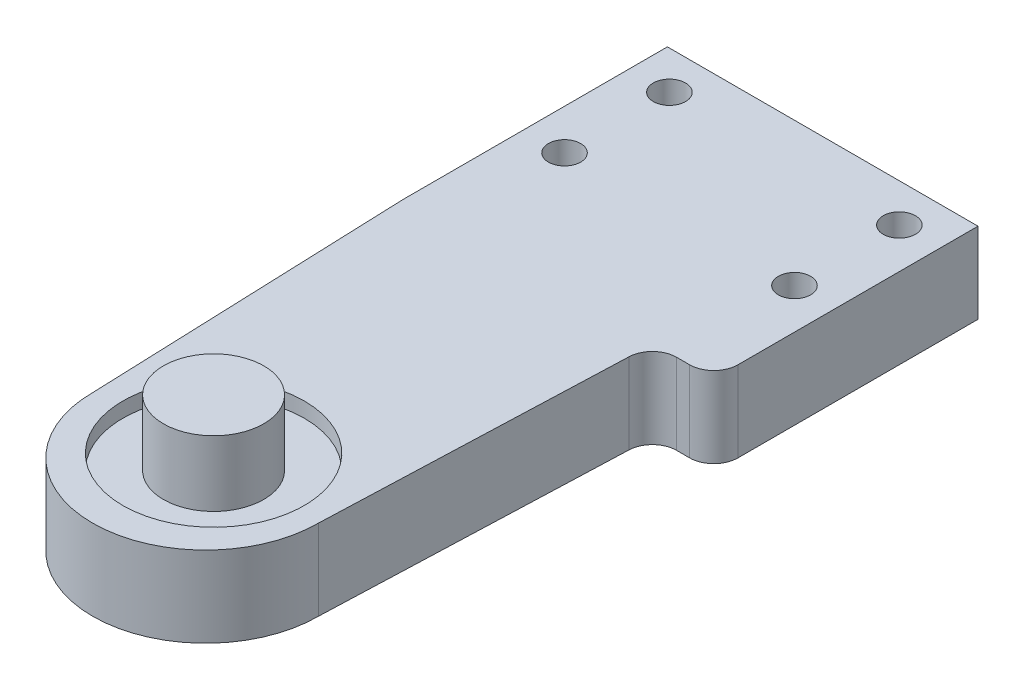
ISO-10303-21;
HEADER;
FILE_DESCRIPTION(('STEP AP214'),'2;1');
FILE_NAME('part.step','',(''),(''),'','','');
FILE_SCHEMA(('AUTOMOTIVE_DESIGN { 1 0 10303 214 1 1 1 1 }'));
ENDSEC;
DATA;
#1=APPLICATION_CONTEXT('core data for automotive mechanical design processes');
#2=APPLICATION_PROTOCOL_DEFINITION('international standard','automotive_design',2000,#1);
#3=PRODUCT_CONTEXT('',#1,'mechanical');
#4=PRODUCT('Part','Part','',(#3));
#5=PRODUCT_RELATED_PRODUCT_CATEGORY('part','',(#4));
#6=PRODUCT_DEFINITION_FORMATION('','',#4);
#7=PRODUCT_DEFINITION_CONTEXT('part definition',#1,'design');
#8=PRODUCT_DEFINITION('design','',#6,#7);
#9=PRODUCT_DEFINITION_SHAPE('','',#8);
#10=(LENGTH_UNIT() NAMED_UNIT(*) SI_UNIT(.MILLI.,.METRE.));
#11=(NAMED_UNIT(*) PLANE_ANGLE_UNIT() SI_UNIT($,.RADIAN.));
#12=(NAMED_UNIT(*) SI_UNIT($,.STERADIAN.) SOLID_ANGLE_UNIT());
#13=UNCERTAINTY_MEASURE_WITH_UNIT(LENGTH_MEASURE(1.E-05),#10,'distance_accuracy_value','');
#14=(GEOMETRIC_REPRESENTATION_CONTEXT(3) GLOBAL_UNCERTAINTY_ASSIGNED_CONTEXT((#13)) GLOBAL_UNIT_ASSIGNED_CONTEXT((#10,
#11,#12)) REPRESENTATION_CONTEXT('',''));
#15=CARTESIAN_POINT('',(0.,0.,0.));
#16=DIRECTION('',(0.,0.,1.));
#17=DIRECTION('',(1.,0.,0.));
#18=AXIS2_PLACEMENT_3D('',#15,#16,#17);
#19=CARTESIAN_POINT('',(19.25,10.,0.));
#20=DIRECTION('',(-1.,0.,0.));
#21=DIRECTION('',(0.,0.,1.));
#22=AXIS2_PLACEMENT_3D('',#19,#20,#21);
#23=PLANE('',#22);
#24=DIRECTION('',(0.,0.,-1.));
#25=VECTOR('',#24,1.);
#26=CARTESIAN_POINT('',(19.25,0.,0.));
#27=LINE('',#26,#25);
#28=CARTESIAN_POINT('',(19.25,0.,18.5));
#29=VERTEX_POINT('',#28);
#30=CARTESIAN_POINT('',(19.25,0.,-11.25));
#31=VERTEX_POINT('',#30);
#32=EDGE_CURVE('E223',#29,#31,#27,.T.);
#33=ORIENTED_EDGE('',*,*,#32,.T.);
#34=DIRECTION('',(0.,-1.,0.));
#35=VECTOR('',#34,1.);
#36=CARTESIAN_POINT('',(19.25,10.,-11.25));
#37=LINE('',#36,#35);
#38=CARTESIAN_POINT('',(19.25,10.,-11.25));
#39=VERTEX_POINT('',#38);
#40=EDGE_CURVE('E11',#39,#31,#37,.T.);
#41=ORIENTED_EDGE('',*,*,#40,.F.);
#42=DIRECTION('',(0.,0.,-1.));
#43=VECTOR('',#42,1.);
#44=CARTESIAN_POINT('',(19.25,10.,0.));
#45=LINE('',#44,#43);
#46=CARTESIAN_POINT('',(19.25,10.,18.5));
#47=VERTEX_POINT('',#46);
#48=EDGE_CURVE('E224',#47,#39,#45,.T.);
#49=ORIENTED_EDGE('',*,*,#48,.F.);
#50=DIRECTION('',(0.,1.,0.));
#51=VECTOR('',#50,1.);
#52=CARTESIAN_POINT('',(19.25,-74.687683054169,18.5));
#53=LINE('',#52,#51);
#54=EDGE_CURVE('E176',#29,#47,#53,.T.);
#55=ORIENTED_EDGE('',*,*,#54,.F.);
#56=EDGE_LOOP('',(#33,#41,#49,#55));
#57=FACE_BOUND('',#56,.T.);
#58=ADVANCED_FACE('F47',(#57),#23,.F.);
#59=CARTESIAN_POINT('',(0.,10.,-11.25));
#60=DIRECTION('',(0.,0.,-1.));
#61=DIRECTION('',(-1.,0.,0.));
#62=AXIS2_PLACEMENT_3D('',#59,#60,#61);
#63=PLANE('',#62);
#64=DIRECTION('',(1.,0.,0.));
#65=VECTOR('',#64,1.);
#66=CARTESIAN_POINT('',(0.,0.,-11.25));
#67=LINE('',#66,#65);
#68=CARTESIAN_POINT('',(-19.25,0.,-11.25));
#69=VERTEX_POINT('',#68);
#70=EDGE_CURVE('E236',#69,#31,#67,.T.);
#71=ORIENTED_EDGE('',*,*,#70,.F.);
#72=DIRECTION('',(0.,-1.,0.));
#73=VECTOR('',#72,1.);
#74=CARTESIAN_POINT('',(-19.25,10.,-11.25));
#75=LINE('',#74,#73);
#76=CARTESIAN_POINT('',(-19.25,10.,-11.25));
#77=VERTEX_POINT('',#76);
#78=EDGE_CURVE('E56',#77,#69,#75,.T.);
#79=ORIENTED_EDGE('',*,*,#78,.F.);
#80=DIRECTION('',(1.,0.,0.));
#81=VECTOR('',#80,1.);
#82=CARTESIAN_POINT('',(0.,10.,-11.25));
#83=LINE('',#82,#81);
#84=EDGE_CURVE('E227',#77,#39,#83,.T.);
#85=ORIENTED_EDGE('',*,*,#84,.T.);
#86=ORIENTED_EDGE('',*,*,#40,.T.);
#87=EDGE_LOOP('',(#71,#79,#85,#86));
#88=FACE_BOUND('',#87,.T.);
#89=ADVANCED_FACE('F243',(#88),#63,.T.);
#90=CARTESIAN_POINT('',(-19.25,10.,0.));
#91=DIRECTION('',(-1.,0.,0.));
#92=DIRECTION('',(0.,0.,1.));
#93=AXIS2_PLACEMENT_3D('',#90,#91,#92);
#94=PLANE('',#93);
#95=DIRECTION('',(0.,0.,-1.));
#96=VECTOR('',#95,1.);
#97=CARTESIAN_POINT('',(-19.25,0.,0.));
#98=LINE('',#97,#96);
#99=CARTESIAN_POINT('',(-19.25,0.,21.5));
#100=VERTEX_POINT('',#99);
#101=EDGE_CURVE('E77',#100,#69,#98,.T.);
#102=ORIENTED_EDGE('',*,*,#101,.F.);
#103=DIRECTION('',(0.,1.,0.));
#104=VECTOR('',#103,1.);
#105=CARTESIAN_POINT('',(-19.25,-74.687683054169,21.5));
#106=LINE('',#105,#104);
#107=CARTESIAN_POINT('',(-19.25,10.,21.5));
#108=VERTEX_POINT('',#107);
#109=EDGE_CURVE('E173',#100,#108,#106,.T.);
#110=ORIENTED_EDGE('',*,*,#109,.T.);
#111=DIRECTION('',(0.,0.,-1.));
#112=VECTOR('',#111,1.);
#113=CARTESIAN_POINT('',(-19.25,10.,0.));
#114=LINE('',#113,#112);
#115=EDGE_CURVE('E230',#108,#77,#114,.T.);
#116=ORIENTED_EDGE('',*,*,#115,.T.);
#117=ORIENTED_EDGE('',*,*,#78,.T.);
#118=EDGE_LOOP('',(#102,#110,#116,#117));
#119=FACE_BOUND('',#118,.T.);
#120=ADVANCED_FACE('F242',(#119),#94,.T.);
#121=CARTESIAN_POINT('',(0.,10.,0.));
#122=DIRECTION('',(0.,1.,0.));
#123=DIRECTION('',(0.,0.,1.));
#124=AXIS2_PLACEMENT_3D('',#121,#122,#123);
#125=PLANE('',#124);
#126=CARTESIAN_POINT('',(-3.74999999999999,10.,60.5));
#127=DIRECTION('',(0.,1.,0.));
#128=DIRECTION('',(0.,0.,1.));
#129=AXIS2_PLACEMENT_3D('',#126,#127,#128);
#130=CIRCLE('',#129,11.2395000000001);
#131=CARTESIAN_POINT('',(-3.74999999999999,10.,71.7395000000001));
#132=VERTEX_POINT('',#131);
#133=EDGE_CURVE('E152',#132,#132,#130,.T.);
#134=ORIENTED_EDGE('',*,*,#133,.F.);
#135=EDGE_LOOP('',(#134));
#136=FACE_BOUND('',#135,.T.);
#137=CARTESIAN_POINT('',(14.25,10.,6.5));
#138=DIRECTION('',(0.,1.,0.));
#139=DIRECTION('',(0.,0.,1.));
#140=AXIS2_PLACEMENT_3D('',#137,#138,#139);
#141=CIRCLE('',#140,2.);
#142=CARTESIAN_POINT('',(14.25,10.,8.5));
#143=VERTEX_POINT('',#142);
#144=EDGE_CURVE('E191',#143,#143,#141,.T.);
#145=ORIENTED_EDGE('',*,*,#144,.F.);
#146=EDGE_LOOP('',(#145));
#147=FACE_BOUND('',#146,.T.);
#148=CARTESIAN_POINT('',(-14.25,10.,-6.5));
#149=DIRECTION('',(0.,1.,0.));
#150=DIRECTION('',(0.,0.,1.));
#151=AXIS2_PLACEMENT_3D('',#148,#149,#150);
#152=CIRCLE('',#151,2.);
#153=CARTESIAN_POINT('',(-14.25,10.,-4.5));
#154=VERTEX_POINT('',#153);
#155=EDGE_CURVE('E199',#154,#154,#152,.T.);
#156=ORIENTED_EDGE('',*,*,#155,.F.);
#157=EDGE_LOOP('',(#156));
#158=FACE_BOUND('',#157,.T.);
#159=CARTESIAN_POINT('',(-14.25,10.,6.5));
#160=DIRECTION('',(0.,1.,0.));
#161=DIRECTION('',(0.,0.,1.));
#162=AXIS2_PLACEMENT_3D('',#159,#160,#161);
#163=CIRCLE('',#162,2.);
#164=CARTESIAN_POINT('',(-14.25,10.,8.5));
#165=VERTEX_POINT('',#164);
#166=EDGE_CURVE('E207',#165,#165,#163,.T.);
#167=ORIENTED_EDGE('',*,*,#166,.F.);
#168=EDGE_LOOP('',(#167));
#169=FACE_BOUND('',#168,.T.);
#170=CARTESIAN_POINT('',(14.25,10.,-6.5));
#171=DIRECTION('',(0.,1.,0.));
#172=DIRECTION('',(0.,0.,1.));
#173=AXIS2_PLACEMENT_3D('',#170,#171,#172);
#174=CIRCLE('',#173,2.);
#175=CARTESIAN_POINT('',(14.25,10.,-4.5));
#176=VERTEX_POINT('',#175);
#177=EDGE_CURVE('E215',#176,#176,#174,.T.);
#178=ORIENTED_EDGE('',*,*,#177,.F.);
#179=EDGE_LOOP('',(#178));
#180=FACE_BOUND('',#179,.T.);
#181=ORIENTED_EDGE('',*,*,#115,.F.);
#182=DIRECTION('',(-0.0374736605890943,0.,-0.999297615709181));
#183=VECTOR('',#182,1.);
#184=CARTESIAN_POINT('',(-20.0280855047589,10.,0.751053206428461));
#185=LINE('',#184,#183);
#186=CARTESIAN_POINT('',(-17.75,10.,61.5));
#187=VERTEX_POINT('',#186);
#188=EDGE_CURVE('E132',#187,#108,#185,.T.);
#189=ORIENTED_EDGE('',*,*,#188,.F.);
#190=CARTESIAN_POINT('',(-3.74999999999999,10.,61.5));
#191=DIRECTION('',(0.,1.,0.));
#192=DIRECTION('',(0.,0.,1.));
#193=AXIS2_PLACEMENT_3D('',#190,#191,#192);
#194=CIRCLE('',#193,14.);
#195=CARTESIAN_POINT('',(10.25,10.,61.5));
#196=VERTEX_POINT('',#195);
#197=EDGE_CURVE('E126',#196,#187,#194,.F.);
#198=ORIENTED_EDGE('',*,*,#197,.F.);
#199=DIRECTION('',(-0.0374736605890941,0.,0.999297615709181));
#200=VECTOR('',#199,1.);
#201=CARTESIAN_POINT('',(12.5386175690435,10.,0.47019815883913));
#202=LINE('',#201,#200);
#203=CARTESIAN_POINT('',(11.6417157868163,10.,24.3875790182327));
#204=VERTEX_POINT('',#203);
#205=EDGE_CURVE('E135',#204,#196,#202,.T.);
#206=ORIENTED_EDGE('',*,*,#205,.F.);
#207=CARTESIAN_POINT('',(14.6396086339438,10.,24.5));
#208=DIRECTION('',(0.,1.,0.));
#209=DIRECTION('',(0.,0.,1.));
#210=AXIS2_PLACEMENT_3D('',#207,#208,#209);
#211=CIRCLE('',#210,3.);
#212=CARTESIAN_POINT('',(14.6396086339438,10.,21.5));
#213=VERTEX_POINT('',#212);
#214=EDGE_CURVE('E142',#204,#213,#211,.F.);
#215=ORIENTED_EDGE('',*,*,#214,.T.);
#216=DIRECTION('',(-1.,0.,0.));
#217=VECTOR('',#216,1.);
#218=CARTESIAN_POINT('',(0.,10.,21.5));
#219=LINE('',#218,#217);
#220=CARTESIAN_POINT('',(16.25,10.,21.5));
#221=VERTEX_POINT('',#220);
#222=EDGE_CURVE('E159',#221,#213,#219,.T.);
#223=ORIENTED_EDGE('',*,*,#222,.F.);
#224=CARTESIAN_POINT('',(16.25,10.,18.5));
#225=DIRECTION('',(0.,1.,0.));
#226=DIRECTION('',(0.,0.,1.));
#227=AXIS2_PLACEMENT_3D('',#224,#225,#226);
#228=CIRCLE('',#227,3.);
#229=EDGE_CURVE('E163',#47,#221,#228,.F.);
#230=ORIENTED_EDGE('',*,*,#229,.F.);
#231=ORIENTED_EDGE('',*,*,#48,.T.);
#232=ORIENTED_EDGE('',*,*,#84,.F.);
#233=EDGE_LOOP('',(#181,#189,#198,#206,#215,#223,#230,#231,#232));
#234=FACE_BOUND('',#233,.T.);
#235=ADVANCED_FACE('F145',(#136,#147,#158,#169,#180,#234),#125,.T.);
#236=CARTESIAN_POINT('',(0.,0.,0.));
#237=DIRECTION('',(0.,1.,0.));
#238=DIRECTION('',(0.,0.,1.));
#239=AXIS2_PLACEMENT_3D('',#236,#237,#238);
#240=PLANE('',#239);
#241=CARTESIAN_POINT('',(14.25,0.,6.5));
#242=DIRECTION('',(0.,1.,0.));
#243=DIRECTION('',(0.,0.,1.));
#244=AXIS2_PLACEMENT_3D('',#241,#242,#243);
#245=CIRCLE('',#244,2.);
#246=CARTESIAN_POINT('',(14.25,0.,8.5));
#247=VERTEX_POINT('',#246);
#248=EDGE_CURVE('E195',#247,#247,#245,.T.);
#249=ORIENTED_EDGE('',*,*,#248,.T.);
#250=EDGE_LOOP('',(#249));
#251=FACE_BOUND('',#250,.T.);
#252=CARTESIAN_POINT('',(-14.25,0.,-6.5));
#253=DIRECTION('',(0.,1.,0.));
#254=DIRECTION('',(0.,0.,1.));
#255=AXIS2_PLACEMENT_3D('',#252,#253,#254);
#256=CIRCLE('',#255,2.);
#257=CARTESIAN_POINT('',(-14.25,0.,-4.5));
#258=VERTEX_POINT('',#257);
#259=EDGE_CURVE('E203',#258,#258,#256,.T.);
#260=ORIENTED_EDGE('',*,*,#259,.T.);
#261=EDGE_LOOP('',(#260));
#262=FACE_BOUND('',#261,.T.);
#263=CARTESIAN_POINT('',(-14.25,0.,6.5));
#264=DIRECTION('',(0.,1.,0.));
#265=DIRECTION('',(0.,0.,1.));
#266=AXIS2_PLACEMENT_3D('',#263,#264,#265);
#267=CIRCLE('',#266,2.);
#268=CARTESIAN_POINT('',(-14.25,0.,8.5));
#269=VERTEX_POINT('',#268);
#270=EDGE_CURVE('E211',#269,#269,#267,.T.);
#271=ORIENTED_EDGE('',*,*,#270,.T.);
#272=EDGE_LOOP('',(#271));
#273=FACE_BOUND('',#272,.T.);
#274=CARTESIAN_POINT('',(14.25,0.,-6.5));
#275=DIRECTION('',(0.,1.,0.));
#276=DIRECTION('',(0.,0.,1.));
#277=AXIS2_PLACEMENT_3D('',#274,#275,#276);
#278=CIRCLE('',#277,2.);
#279=CARTESIAN_POINT('',(14.25,0.,-4.5));
#280=VERTEX_POINT('',#279);
#281=EDGE_CURVE('E219',#280,#280,#278,.T.);
#282=ORIENTED_EDGE('',*,*,#281,.T.);
#283=EDGE_LOOP('',(#282));
#284=FACE_BOUND('',#283,.T.);
#285=ORIENTED_EDGE('',*,*,#32,.F.);
#286=CARTESIAN_POINT('',(16.25,0.,18.5));
#287=DIRECTION('',(0.,1.,0.));
#288=DIRECTION('',(0.,0.,1.));
#289=AXIS2_PLACEMENT_3D('',#286,#287,#288);
#290=CIRCLE('',#289,3.);
#291=CARTESIAN_POINT('',(16.25,0.,21.5));
#292=VERTEX_POINT('',#291);
#293=EDGE_CURVE('E251',#292,#29,#290,.T.);
#294=ORIENTED_EDGE('',*,*,#293,.F.);
#295=DIRECTION('',(1.,0.,0.));
#296=VECTOR('',#295,1.);
#297=CARTESIAN_POINT('',(0.,0.,21.5));
#298=LINE('',#297,#296);
#299=CARTESIAN_POINT('',(14.6396086339438,0.,21.5));
#300=VERTEX_POINT('',#299);
#301=EDGE_CURVE('E277',#300,#292,#298,.T.);
#302=ORIENTED_EDGE('',*,*,#301,.F.);
#303=CARTESIAN_POINT('',(14.6396086339438,0.,24.5));
#304=DIRECTION('',(0.,1.,0.));
#305=DIRECTION('',(0.,0.,1.));
#306=AXIS2_PLACEMENT_3D('',#303,#304,#305);
#307=CIRCLE('',#306,3.);
#308=CARTESIAN_POINT('',(11.6417157868163,0.,24.3875790182327));
#309=VERTEX_POINT('',#308);
#310=EDGE_CURVE('E190',#300,#309,#307,.T.);
#311=ORIENTED_EDGE('',*,*,#310,.T.);
#312=DIRECTION('',(0.0374736605890941,0.,-0.999297615709181));
#313=VECTOR('',#312,1.);
#314=CARTESIAN_POINT('',(12.5386175690435,0.,0.47019815883913));
#315=LINE('',#314,#313);
#316=CARTESIAN_POINT('',(10.25,0.,61.5));
#317=VERTEX_POINT('',#316);
#318=EDGE_CURVE('E172',#317,#309,#315,.T.);
#319=ORIENTED_EDGE('',*,*,#318,.F.);
#320=CARTESIAN_POINT('',(-3.74999999999999,0.,61.5));
#321=DIRECTION('',(0.,1.,0.));
#322=DIRECTION('',(0.,0.,1.));
#323=AXIS2_PLACEMENT_3D('',#320,#321,#322);
#324=CIRCLE('',#323,14.);
#325=CARTESIAN_POINT('',(-17.75,0.,61.5));
#326=VERTEX_POINT('',#325);
#327=EDGE_CURVE('E127',#326,#317,#324,.T.);
#328=ORIENTED_EDGE('',*,*,#327,.F.);
#329=DIRECTION('',(0.0374736605890943,0.,0.999297615709181));
#330=VECTOR('',#329,1.);
#331=CARTESIAN_POINT('',(-20.0280855047589,0.,0.751053206428461));
#332=LINE('',#331,#330);
#333=EDGE_CURVE('E247',#100,#326,#332,.T.);
#334=ORIENTED_EDGE('',*,*,#333,.F.);
#335=ORIENTED_EDGE('',*,*,#101,.T.);
#336=ORIENTED_EDGE('',*,*,#70,.T.);
#337=EDGE_LOOP('',(#285,#294,#302,#311,#319,#328,#334,#335,#336));
#338=FACE_BOUND('',#337,.T.);
#339=ADVANCED_FACE('F245',(#251,#262,#273,#284,#338),#240,.F.);
#340=CARTESIAN_POINT('',(14.25,10.,-6.5));
#341=DIRECTION('',(0.,1.,0.));
#342=DIRECTION('',(0.,0.,1.));
#343=AXIS2_PLACEMENT_3D('',#340,#341,#342);
#344=CYLINDRICAL_SURFACE('',#343,2.);
#345=ORIENTED_EDGE('',*,*,#281,.F.);
#346=EDGE_LOOP('',(#345));
#347=FACE_BOUND('',#346,.T.);
#348=ORIENTED_EDGE('',*,*,#177,.T.);
#349=EDGE_LOOP('',(#348));
#350=FACE_BOUND('',#349,.T.);
#351=ADVANCED_FACE('F331',(#347,#350),#344,.F.);
#352=CARTESIAN_POINT('',(-14.25,10.,6.5));
#353=DIRECTION('',(0.,1.,0.));
#354=DIRECTION('',(0.,0.,1.));
#355=AXIS2_PLACEMENT_3D('',#352,#353,#354);
#356=CYLINDRICAL_SURFACE('',#355,2.);
#357=ORIENTED_EDGE('',*,*,#270,.F.);
#358=EDGE_LOOP('',(#357));
#359=FACE_BOUND('',#358,.T.);
#360=ORIENTED_EDGE('',*,*,#166,.T.);
#361=EDGE_LOOP('',(#360));
#362=FACE_BOUND('',#361,.T.);
#363=ADVANCED_FACE('F333',(#359,#362),#356,.F.);
#364=CARTESIAN_POINT('',(-14.25,10.,-6.5));
#365=DIRECTION('',(0.,1.,0.));
#366=DIRECTION('',(0.,0.,1.));
#367=AXIS2_PLACEMENT_3D('',#364,#365,#366);
#368=CYLINDRICAL_SURFACE('',#367,2.);
#369=ORIENTED_EDGE('',*,*,#259,.F.);
#370=EDGE_LOOP('',(#369));
#371=FACE_BOUND('',#370,.T.);
#372=ORIENTED_EDGE('',*,*,#155,.T.);
#373=EDGE_LOOP('',(#372));
#374=FACE_BOUND('',#373,.T.);
#375=ADVANCED_FACE('F339',(#371,#374),#368,.F.);
#376=CARTESIAN_POINT('',(14.25,10.,6.5));
#377=DIRECTION('',(0.,1.,0.));
#378=DIRECTION('',(0.,0.,1.));
#379=AXIS2_PLACEMENT_3D('',#376,#377,#378);
#380=CYLINDRICAL_SURFACE('',#379,2.);
#381=ORIENTED_EDGE('',*,*,#248,.F.);
#382=EDGE_LOOP('',(#381));
#383=FACE_BOUND('',#382,.T.);
#384=ORIENTED_EDGE('',*,*,#144,.T.);
#385=EDGE_LOOP('',(#384));
#386=FACE_BOUND('',#385,.T.);
#387=ADVANCED_FACE('F364',(#383,#386),#380,.F.);
#388=CARTESIAN_POINT('',(12.5386175690435,-74.687683054169,0.47019815883913));
#389=DIRECTION('',(-0.999297615709181,0.,-0.0374736605890941));
#390=DIRECTION('',(-0.0374736605890941,0.,0.999297615709181));
#391=AXIS2_PLACEMENT_3D('',#388,#389,#390);
#392=PLANE('',#391);
#393=DIRECTION('',(0.,1.,0.));
#394=VECTOR('',#393,1.);
#395=CARTESIAN_POINT('',(10.25,-74.687683054169,61.5));
#396=LINE('',#395,#394);
#397=EDGE_CURVE('E121',#317,#196,#396,.T.);
#398=ORIENTED_EDGE('',*,*,#397,.F.);
#399=ORIENTED_EDGE('',*,*,#318,.T.);
#400=DIRECTION('',(0.,1.,0.));
#401=VECTOR('',#400,1.);
#402=CARTESIAN_POINT('',(11.6417157868163,-74.687683054169,24.3875790182327));
#403=LINE('',#402,#401);
#404=EDGE_CURVE('E131',#309,#204,#403,.T.);
#405=ORIENTED_EDGE('',*,*,#404,.T.);
#406=ORIENTED_EDGE('',*,*,#205,.T.);
#407=EDGE_LOOP('',(#398,#399,#405,#406));
#408=FACE_BOUND('',#407,.T.);
#409=ADVANCED_FACE('F136',(#408),#392,.F.);
#410=CARTESIAN_POINT('',(14.6396086339438,-74.687683054169,24.5));
#411=DIRECTION('',(0.,1.,0.));
#412=DIRECTION('',(0.,0.,1.));
#413=AXIS2_PLACEMENT_3D('',#410,#411,#412);
#414=CYLINDRICAL_SURFACE('',#413,3.);
#415=ORIENTED_EDGE('',*,*,#310,.F.);
#416=DIRECTION('',(0.,1.,0.));
#417=VECTOR('',#416,1.);
#418=CARTESIAN_POINT('',(14.6396086339438,-74.687683054169,21.5));
#419=LINE('',#418,#417);
#420=EDGE_CURVE('E183',#300,#213,#419,.T.);
#421=ORIENTED_EDGE('',*,*,#420,.T.);
#422=ORIENTED_EDGE('',*,*,#214,.F.);
#423=ORIENTED_EDGE('',*,*,#404,.F.);
#424=EDGE_LOOP('',(#415,#421,#422,#423));
#425=FACE_BOUND('',#424,.T.);
#426=ADVANCED_FACE('F363',(#425),#414,.F.);
#427=CARTESIAN_POINT('',(0.,-74.687683054169,21.5));
#428=DIRECTION('',(0.,0.,-1.));
#429=DIRECTION('',(-1.,0.,0.));
#430=AXIS2_PLACEMENT_3D('',#427,#428,#429);
#431=PLANE('',#430);
#432=ORIENTED_EDGE('',*,*,#420,.F.);
#433=ORIENTED_EDGE('',*,*,#301,.T.);
#434=DIRECTION('',(0.,1.,0.));
#435=VECTOR('',#434,1.);
#436=CARTESIAN_POINT('',(16.25,-74.687683054169,21.5));
#437=LINE('',#436,#435);
#438=EDGE_CURVE('E180',#292,#221,#437,.T.);
#439=ORIENTED_EDGE('',*,*,#438,.T.);
#440=ORIENTED_EDGE('',*,*,#222,.T.);
#441=EDGE_LOOP('',(#432,#433,#439,#440));
#442=FACE_BOUND('',#441,.T.);
#443=ADVANCED_FACE('F262',(#442),#431,.F.);
#444=CARTESIAN_POINT('',(16.25,-74.687683054169,18.5));
#445=DIRECTION('',(0.,1.,0.));
#446=DIRECTION('',(0.,0.,1.));
#447=AXIS2_PLACEMENT_3D('',#444,#445,#446);
#448=CYLINDRICAL_SURFACE('',#447,3.);
#449=ORIENTED_EDGE('',*,*,#438,.F.);
#450=ORIENTED_EDGE('',*,*,#293,.T.);
#451=ORIENTED_EDGE('',*,*,#54,.T.);
#452=ORIENTED_EDGE('',*,*,#229,.T.);
#453=EDGE_LOOP('',(#449,#450,#451,#452));
#454=FACE_BOUND('',#453,.T.);
#455=ADVANCED_FACE('F254',(#454),#448,.T.);
#456=CARTESIAN_POINT('',(-20.0280855047589,-74.687683054169,0.751053206428461));
#457=DIRECTION('',(0.999297615709181,0.,-0.0374736605890943));
#458=DIRECTION('',(-0.0374736605890943,0.,-0.999297615709181));
#459=AXIS2_PLACEMENT_3D('',#456,#457,#458);
#460=PLANE('',#459);
#461=ORIENTED_EDGE('',*,*,#109,.F.);
#462=ORIENTED_EDGE('',*,*,#333,.T.);
#463=DIRECTION('',(0.,1.,0.));
#464=VECTOR('',#463,1.);
#465=CARTESIAN_POINT('',(-17.75,-74.687683054169,61.5));
#466=LINE('',#465,#464);
#467=EDGE_CURVE('E169',#326,#187,#466,.T.);
#468=ORIENTED_EDGE('',*,*,#467,.T.);
#469=ORIENTED_EDGE('',*,*,#188,.T.);
#470=EDGE_LOOP('',(#461,#462,#468,#469));
#471=FACE_BOUND('',#470,.T.);
#472=ADVANCED_FACE('F252',(#471),#460,.F.);
#473=CARTESIAN_POINT('',(-3.74999999999999,-74.687683054169,61.5));
#474=DIRECTION('',(0.,1.,0.));
#475=DIRECTION('',(0.,0.,1.));
#476=AXIS2_PLACEMENT_3D('',#473,#474,#475);
#477=CYLINDRICAL_SURFACE('',#476,14.);
#478=ORIENTED_EDGE('',*,*,#467,.F.);
#479=ORIENTED_EDGE('',*,*,#327,.T.);
#480=ORIENTED_EDGE('',*,*,#397,.T.);
#481=ORIENTED_EDGE('',*,*,#197,.T.);
#482=EDGE_LOOP('',(#478,#479,#480,#481));
#483=FACE_BOUND('',#482,.T.);
#484=ADVANCED_FACE('F124',(#483),#477,.T.);
#485=CARTESIAN_POINT('',(-3.74999999999999,8.1458,60.5));
#486=DIRECTION('',(0.,1.,0.));
#487=DIRECTION('',(0.,0.,1.));
#488=AXIS2_PLACEMENT_3D('',#485,#486,#487);
#489=CYLINDRICAL_SURFACE('',#488,11.2395000000001);
#490=CARTESIAN_POINT('',(-3.74999999999999,8.1458,60.5));
#491=DIRECTION('',(0.,1.,0.));
#492=DIRECTION('',(0.,0.,1.));
#493=AXIS2_PLACEMENT_3D('',#490,#491,#492);
#494=CIRCLE('',#493,11.2395000000001);
#495=CARTESIAN_POINT('',(-3.74999999999999,8.1458,71.7395000000001));
#496=VERTEX_POINT('',#495);
#497=EDGE_CURVE('E148',#496,#496,#494,.T.);
#498=ORIENTED_EDGE('',*,*,#497,.F.);
#499=EDGE_LOOP('',(#498));
#500=FACE_BOUND('',#499,.T.);
#501=ORIENTED_EDGE('',*,*,#133,.T.);
#502=EDGE_LOOP('',(#501));
#503=FACE_BOUND('',#502,.T.);
#504=ADVANCED_FACE('F260',(#500,#503),#489,.F.);
#505=CARTESIAN_POINT('',(-3.74999999999999,8.1458,60.5));
#506=DIRECTION('',(0.,1.,0.));
#507=DIRECTION('',(0.,0.,1.));
#508=AXIS2_PLACEMENT_3D('',#505,#506,#507);
#509=PLANE('',#508);
#510=CARTESIAN_POINT('',(-3.74999999999999,8.1458,60.5));
#511=DIRECTION('',(0.,1.,0.));
#512=DIRECTION('',(0.,0.,1.));
#513=AXIS2_PLACEMENT_3D('',#510,#511,#512);
#514=CIRCLE('',#513,6.22300000000007);
#515=CARTESIAN_POINT('',(-3.74999999999999,8.1458,66.7230000000001));
#516=VERTEX_POINT('',#515);
#517=EDGE_CURVE('E294',#516,#516,#514,.T.);
#518=ORIENTED_EDGE('',*,*,#517,.F.);
#519=EDGE_LOOP('',(#518));
#520=FACE_BOUND('',#519,.T.);
#521=ORIENTED_EDGE('',*,*,#497,.T.);
#522=EDGE_LOOP('',(#521));
#523=FACE_BOUND('',#522,.T.);
#524=ADVANCED_FACE('F307',(#520,#523),#509,.T.);
#525=CARTESIAN_POINT('',(-3.74999999999999,16.2738,60.5));
#526=DIRECTION('',(0.,-1.,0.));
#527=DIRECTION('',(0.,0.,-1.));
#528=AXIS2_PLACEMENT_3D('',#525,#526,#527);
#529=CYLINDRICAL_SURFACE('',#528,6.22300000000007);
#530=CARTESIAN_POINT('',(-3.74999999999999,16.2738,60.5));
#531=DIRECTION('',(0.,1.,0.));
#532=DIRECTION('',(0.,0.,1.));
#533=AXIS2_PLACEMENT_3D('',#530,#531,#532);
#534=CIRCLE('',#533,6.22300000000007);
#535=CARTESIAN_POINT('',(-3.74999999999999,16.2738,66.7230000000001));
#536=VERTEX_POINT('',#535);
#537=EDGE_CURVE('E292',#536,#536,#534,.T.);
#538=ORIENTED_EDGE('',*,*,#537,.F.);
#539=EDGE_LOOP('',(#538));
#540=FACE_BOUND('',#539,.T.);
#541=ORIENTED_EDGE('',*,*,#517,.T.);
#542=EDGE_LOOP('',(#541));
#543=FACE_BOUND('',#542,.T.);
#544=ADVANCED_FACE('F304',(#540,#543),#529,.T.);
#545=CARTESIAN_POINT('',(-3.74999999999999,16.2738,60.5));
#546=DIRECTION('',(0.,1.,0.));
#547=DIRECTION('',(0.,0.,1.));
#548=AXIS2_PLACEMENT_3D('',#545,#546,#547);
#549=PLANE('',#548);
#550=ORIENTED_EDGE('',*,*,#537,.T.);
#551=EDGE_LOOP('',(#550));
#552=FACE_BOUND('',#551,.T.);
#553=ADVANCED_FACE('F302',(#552),#549,.T.);
#554=CLOSED_SHELL('',(#58,#89,#120,#235,#339,#351,#363,#375,#387,#409,#426,#443,#455,#472,#484,
#504,#524,#544,#553));
#555=MANIFOLD_SOLID_BREP('B2',#554);
#556=ADVANCED_BREP_SHAPE_REPRESENTATION('',(#18,#555),#14);
#557=SHAPE_DEFINITION_REPRESENTATION(#9,#556);
ENDSEC;
END-ISO-10303-21;
